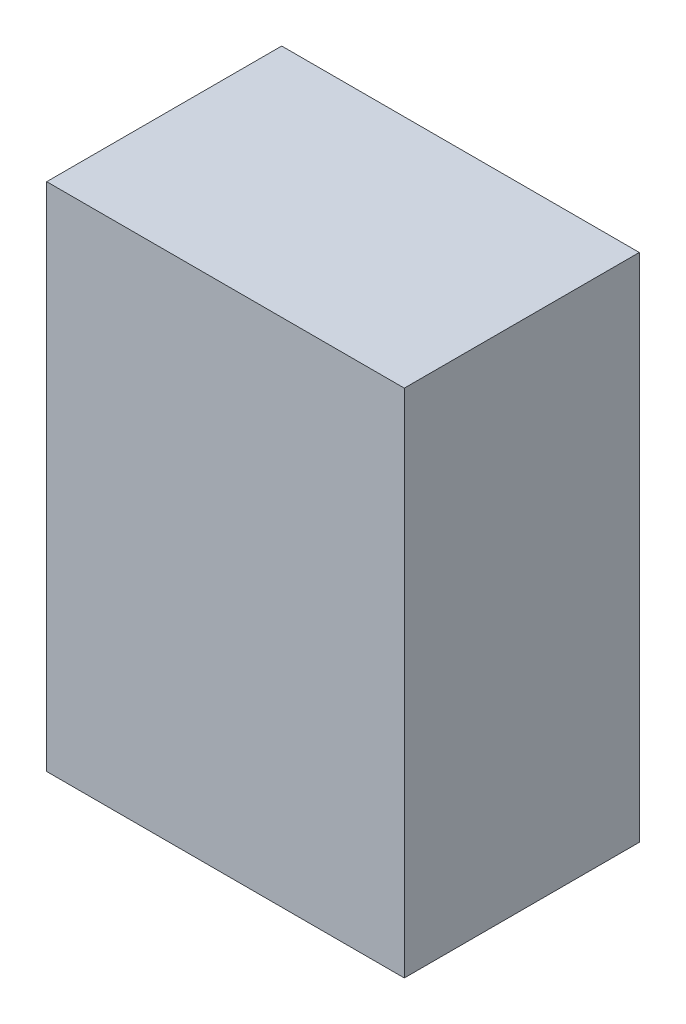
ISO-10303-21;
HEADER;
FILE_DESCRIPTION(('STEP AP214'),'2;1');
FILE_NAME('part.step','',(''),(''),'','','');
FILE_SCHEMA(('AUTOMOTIVE_DESIGN { 1 0 10303 214 1 1 1 1 }'));
ENDSEC;
DATA;
#1=APPLICATION_CONTEXT('core data for automotive mechanical design processes');
#2=APPLICATION_PROTOCOL_DEFINITION('international standard','automotive_design',2000,#1);
#3=PRODUCT_CONTEXT('',#1,'mechanical');
#4=PRODUCT('Part','Part','',(#3));
#5=PRODUCT_RELATED_PRODUCT_CATEGORY('part','',(#4));
#6=PRODUCT_DEFINITION_FORMATION('','',#4);
#7=PRODUCT_DEFINITION_CONTEXT('part definition',#1,'design');
#8=PRODUCT_DEFINITION('design','',#6,#7);
#9=PRODUCT_DEFINITION_SHAPE('','',#8);
#10=(LENGTH_UNIT() NAMED_UNIT(*) SI_UNIT(.MILLI.,.METRE.));
#11=(NAMED_UNIT(*) PLANE_ANGLE_UNIT() SI_UNIT($,.RADIAN.));
#12=(NAMED_UNIT(*) SI_UNIT($,.STERADIAN.) SOLID_ANGLE_UNIT());
#13=UNCERTAINTY_MEASURE_WITH_UNIT(LENGTH_MEASURE(1.E-05),#10,'distance_accuracy_value','');
#14=(GEOMETRIC_REPRESENTATION_CONTEXT(3) GLOBAL_UNCERTAINTY_ASSIGNED_CONTEXT((#13)) GLOBAL_UNIT_ASSIGNED_CONTEXT((#10,
#11,#12)) REPRESENTATION_CONTEXT('',''));
#15=CARTESIAN_POINT('',(0.,0.,0.));
#16=DIRECTION('',(0.,0.,1.));
#17=DIRECTION('',(1.,0.,0.));
#18=AXIS2_PLACEMENT_3D('',#15,#16,#17);
#19=CARTESIAN_POINT('',(17.5,25.,23.));
#20=DIRECTION('',(-1.,0.,0.));
#21=DIRECTION('',(0.,0.,1.));
#22=AXIS2_PLACEMENT_3D('',#19,#20,#21);
#23=PLANE('',#22);
#24=DIRECTION('',(0.,1.,0.));
#25=VECTOR('',#24,1.);
#26=CARTESIAN_POINT('',(17.5,25.,0.));
#27=LINE('',#26,#25);
#28=CARTESIAN_POINT('',(17.5,-25.,0.));
#29=VERTEX_POINT('',#28);
#30=CARTESIAN_POINT('',(17.5,25.,0.));
#31=VERTEX_POINT('',#30);
#32=EDGE_CURVE('E106',#29,#31,#27,.T.);
#33=ORIENTED_EDGE('',*,*,#32,.T.);
#34=DIRECTION('',(0.,0.,-1.));
#35=VECTOR('',#34,1.);
#36=CARTESIAN_POINT('',(17.5,25.,23.));
#37=LINE('',#36,#35);
#38=CARTESIAN_POINT('',(17.5,25.,23.));
#39=VERTEX_POINT('',#38);
#40=EDGE_CURVE('E11',#39,#31,#37,.T.);
#41=ORIENTED_EDGE('',*,*,#40,.F.);
#42=DIRECTION('',(0.,1.,0.));
#43=VECTOR('',#42,1.);
#44=CARTESIAN_POINT('',(17.5,25.,23.));
#45=LINE('',#44,#43);
#46=CARTESIAN_POINT('',(17.5,-25.,23.));
#47=VERTEX_POINT('',#46);
#48=EDGE_CURVE('E94',#47,#39,#45,.T.);
#49=ORIENTED_EDGE('',*,*,#48,.F.);
#50=DIRECTION('',(0.,0.,-1.));
#51=VECTOR('',#50,1.);
#52=CARTESIAN_POINT('',(17.5,-25.,23.));
#53=LINE('',#52,#51);
#54=EDGE_CURVE('E102',#47,#29,#53,.T.);
#55=ORIENTED_EDGE('',*,*,#54,.T.);
#56=EDGE_LOOP('',(#33,#41,#49,#55));
#57=FACE_BOUND('',#56,.T.);
#58=ADVANCED_FACE('F43',(#57),#23,.F.);
#59=CARTESIAN_POINT('',(-17.5,25.,23.));
#60=DIRECTION('',(0.,-1.,0.));
#61=DIRECTION('',(0.,0.,-1.));
#62=AXIS2_PLACEMENT_3D('',#59,#60,#61);
#63=PLANE('',#62);
#64=DIRECTION('',(-1.,0.,0.));
#65=VECTOR('',#64,1.);
#66=CARTESIAN_POINT('',(-17.5,25.,0.));
#67=LINE('',#66,#65);
#68=CARTESIAN_POINT('',(-17.5,25.,0.));
#69=VERTEX_POINT('',#68);
#70=EDGE_CURVE('E98',#31,#69,#67,.T.);
#71=ORIENTED_EDGE('',*,*,#70,.T.);
#72=DIRECTION('',(0.,0.,-1.));
#73=VECTOR('',#72,1.);
#74=CARTESIAN_POINT('',(-17.5,25.,23.));
#75=LINE('',#74,#73);
#76=CARTESIAN_POINT('',(-17.5,25.,23.));
#77=VERTEX_POINT('',#76);
#78=EDGE_CURVE('E51',#77,#69,#75,.T.);
#79=ORIENTED_EDGE('',*,*,#78,.F.);
#80=DIRECTION('',(-1.,0.,0.));
#81=VECTOR('',#80,1.);
#82=CARTESIAN_POINT('',(-17.5,25.,23.));
#83=LINE('',#82,#81);
#84=EDGE_CURVE('E89',#39,#77,#83,.T.);
#85=ORIENTED_EDGE('',*,*,#84,.F.);
#86=ORIENTED_EDGE('',*,*,#40,.T.);
#87=EDGE_LOOP('',(#71,#79,#85,#86));
#88=FACE_BOUND('',#87,.T.);
#89=ADVANCED_FACE('F97',(#88),#63,.F.);
#90=CARTESIAN_POINT('',(-17.5,25.,23.));
#91=DIRECTION('',(1.,0.,0.));
#92=DIRECTION('',(0.,1.,0.));
#93=AXIS2_PLACEMENT_3D('',#90,#91,#92);
#94=PLANE('',#93);
#95=DIRECTION('',(0.,-1.,0.));
#96=VECTOR('',#95,1.);
#97=CARTESIAN_POINT('',(-17.5,25.,0.));
#98=LINE('',#97,#96);
#99=CARTESIAN_POINT('',(-17.5,-25.,0.));
#100=VERTEX_POINT('',#99);
#101=EDGE_CURVE('E76',#69,#100,#98,.T.);
#102=ORIENTED_EDGE('',*,*,#101,.T.);
#103=DIRECTION('',(0.,0.,-1.));
#104=VECTOR('',#103,1.);
#105=CARTESIAN_POINT('',(-17.5,-25.,23.));
#106=LINE('',#105,#104);
#107=CARTESIAN_POINT('',(-17.5,-25.,23.));
#108=VERTEX_POINT('',#107);
#109=EDGE_CURVE('E99',#108,#100,#106,.T.);
#110=ORIENTED_EDGE('',*,*,#109,.F.);
#111=DIRECTION('',(0.,-1.,0.));
#112=VECTOR('',#111,1.);
#113=CARTESIAN_POINT('',(-17.5,25.,23.));
#114=LINE('',#113,#112);
#115=EDGE_CURVE('E92',#77,#108,#114,.T.);
#116=ORIENTED_EDGE('',*,*,#115,.F.);
#117=ORIENTED_EDGE('',*,*,#78,.T.);
#118=EDGE_LOOP('',(#102,#110,#116,#117));
#119=FACE_BOUND('',#118,.T.);
#120=ADVANCED_FACE('F100',(#119),#94,.F.);
#121=CARTESIAN_POINT('',(-17.5,-25.,23.));
#122=DIRECTION('',(0.,1.,0.));
#123=DIRECTION('',(0.,0.,1.));
#124=AXIS2_PLACEMENT_3D('',#121,#122,#123);
#125=PLANE('',#124);
#126=DIRECTION('',(1.,0.,0.));
#127=VECTOR('',#126,1.);
#128=CARTESIAN_POINT('',(-17.5,-25.,0.));
#129=LINE('',#128,#127);
#130=EDGE_CURVE('E82',#100,#29,#129,.T.);
#131=ORIENTED_EDGE('',*,*,#130,.T.);
#132=ORIENTED_EDGE('',*,*,#54,.F.);
#133=DIRECTION('',(1.,0.,0.));
#134=VECTOR('',#133,1.);
#135=CARTESIAN_POINT('',(-17.5,-25.,23.));
#136=LINE('',#135,#134);
#137=EDGE_CURVE('E59',#108,#47,#136,.T.);
#138=ORIENTED_EDGE('',*,*,#137,.F.);
#139=ORIENTED_EDGE('',*,*,#109,.T.);
#140=EDGE_LOOP('',(#131,#132,#138,#139));
#141=FACE_BOUND('',#140,.T.);
#142=ADVANCED_FACE('F113',(#141),#125,.F.);
#143=CARTESIAN_POINT('',(0.,0.,23.));
#144=DIRECTION('',(0.,0.,1.));
#145=DIRECTION('',(1.,0.,0.));
#146=AXIS2_PLACEMENT_3D('',#143,#144,#145);
#147=PLANE('',#146);
#148=ORIENTED_EDGE('',*,*,#48,.T.);
#149=ORIENTED_EDGE('',*,*,#84,.T.);
#150=ORIENTED_EDGE('',*,*,#115,.T.);
#151=ORIENTED_EDGE('',*,*,#137,.T.);
#152=EDGE_LOOP('',(#148,#149,#150,#151));
#153=FACE_BOUND('',#152,.T.);
#154=ADVANCED_FACE('F90',(#153),#147,.T.);
#155=CARTESIAN_POINT('',(0.,0.,0.));
#156=DIRECTION('',(0.,0.,1.));
#157=DIRECTION('',(1.,0.,0.));
#158=AXIS2_PLACEMENT_3D('',#155,#156,#157);
#159=PLANE('',#158);
#160=ORIENTED_EDGE('',*,*,#32,.F.);
#161=ORIENTED_EDGE('',*,*,#130,.F.);
#162=ORIENTED_EDGE('',*,*,#101,.F.);
#163=ORIENTED_EDGE('',*,*,#70,.F.);
#164=EDGE_LOOP('',(#160,#161,#162,#163));
#165=FACE_BOUND('',#164,.T.);
#166=ADVANCED_FACE('F116',(#165),#159,.F.);
#167=CLOSED_SHELL('',(#58,#89,#120,#142,#154,#166));
#168=MANIFOLD_SOLID_BREP('B2',#167);
#169=ADVANCED_BREP_SHAPE_REPRESENTATION('',(#18,#168),#14);
#170=SHAPE_DEFINITION_REPRESENTATION(#9,#169);
ENDSEC;
END-ISO-10303-21;
